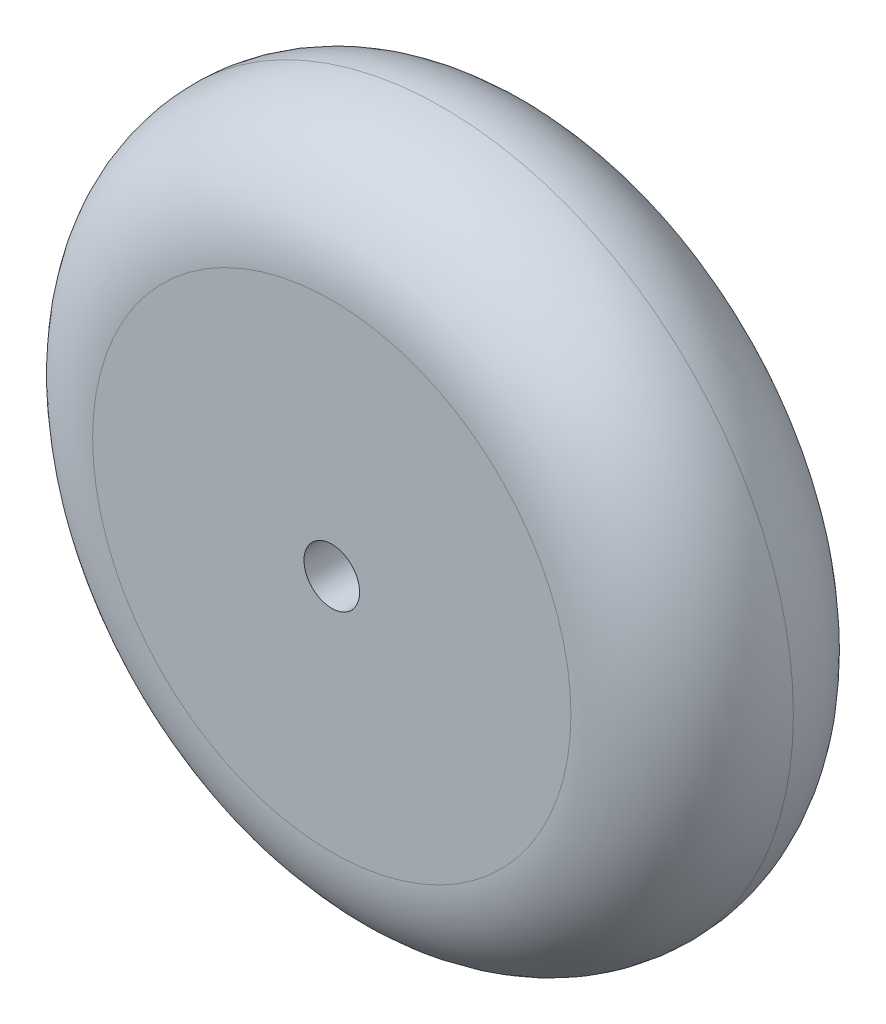
ISO-10303-21;
HEADER;
FILE_DESCRIPTION(('STEP AP214'),'2;1');
FILE_NAME('part.step','',(''),(''),'','','');
FILE_SCHEMA(('AUTOMOTIVE_DESIGN { 1 0 10303 214 1 1 1 1 }'));
ENDSEC;
DATA;
#1=APPLICATION_CONTEXT('core data for automotive mechanical design processes');
#2=APPLICATION_PROTOCOL_DEFINITION('international standard','automotive_design',2000,#1);
#3=PRODUCT_CONTEXT('',#1,'mechanical');
#4=PRODUCT('Part','Part','',(#3));
#5=PRODUCT_RELATED_PRODUCT_CATEGORY('part','',(#4));
#6=PRODUCT_DEFINITION_FORMATION('','',#4);
#7=PRODUCT_DEFINITION_CONTEXT('part definition',#1,'design');
#8=PRODUCT_DEFINITION('design','',#6,#7);
#9=PRODUCT_DEFINITION_SHAPE('','',#8);
#10=(LENGTH_UNIT() NAMED_UNIT(*) SI_UNIT(.MILLI.,.METRE.));
#11=(NAMED_UNIT(*) PLANE_ANGLE_UNIT() SI_UNIT($,.RADIAN.));
#12=(NAMED_UNIT(*) SI_UNIT($,.STERADIAN.) SOLID_ANGLE_UNIT());
#13=UNCERTAINTY_MEASURE_WITH_UNIT(LENGTH_MEASURE(1.E-05),#10,'distance_accuracy_value','');
#14=(GEOMETRIC_REPRESENTATION_CONTEXT(3) GLOBAL_UNCERTAINTY_ASSIGNED_CONTEXT((#13)) GLOBAL_UNIT_ASSIGNED_CONTEXT((#10,
#11,#12)) REPRESENTATION_CONTEXT('',''));
#15=CARTESIAN_POINT('',(0.,0.,0.));
#16=DIRECTION('',(0.,0.,1.));
#17=DIRECTION('',(1.,0.,0.));
#18=AXIS2_PLACEMENT_3D('',#15,#16,#17);
#19=CARTESIAN_POINT('',(0.,0.,25.4));
#20=DIRECTION('',(0.,0.,1.));
#21=DIRECTION('',(1.,0.,0.));
#22=AXIS2_PLACEMENT_3D('',#19,#20,#21);
#23=PLANE('',#22);
#24=CARTESIAN_POINT('',(0.,0.,25.4));
#25=DIRECTION('',(0.,0.,1.));
#26=DIRECTION('',(1.,0.,0.));
#27=AXIS2_PLACEMENT_3D('',#24,#25,#26);
#28=CIRCLE('',#27,27.305);
#29=CARTESIAN_POINT('',(27.305,0.,25.4));
#30=VERTEX_POINT('',#29);
#31=EDGE_CURVE('E10',#30,#30,#28,.T.);
#32=ORIENTED_EDGE('',*,*,#31,.T.);
#33=EDGE_LOOP('',(#32));
#34=FACE_BOUND('',#33,.T.);
#35=CARTESIAN_POINT('',(0.,0.,25.4));
#36=DIRECTION('',(0.,0.,1.));
#37=DIRECTION('',(1.,0.,0.));
#38=AXIS2_PLACEMENT_3D('',#35,#36,#37);
#39=CIRCLE('',#38,3.175);
#40=CARTESIAN_POINT('',(3.175,0.,25.4));
#41=VERTEX_POINT('',#40);
#42=EDGE_CURVE('E51',#41,#41,#39,.T.);
#43=ORIENTED_EDGE('',*,*,#42,.F.);
#44=EDGE_LOOP('',(#43));
#45=FACE_BOUND('',#44,.T.);
#46=ADVANCED_FACE('F34',(#34,#45),#23,.T.);
#47=CARTESIAN_POINT('',(0.,0.,0.));
#48=DIRECTION('',(0.,0.,1.));
#49=DIRECTION('',(1.,0.,0.));
#50=AXIS2_PLACEMENT_3D('',#47,#48,#49);
#51=PLANE('',#50);
#52=CARTESIAN_POINT('',(0.,0.,0.));
#53=DIRECTION('',(0.,0.,1.));
#54=DIRECTION('',(1.,0.,0.));
#55=AXIS2_PLACEMENT_3D('',#52,#53,#54);
#56=CIRCLE('',#55,27.305);
#57=CARTESIAN_POINT('',(27.305,0.,0.));
#58=VERTEX_POINT('',#57);
#59=EDGE_CURVE('E42',#58,#58,#56,.F.);
#60=ORIENTED_EDGE('',*,*,#59,.T.);
#61=EDGE_LOOP('',(#60));
#62=FACE_BOUND('',#61,.T.);
#63=CARTESIAN_POINT('',(0.,0.,0.));
#64=DIRECTION('',(0.,0.,1.));
#65=DIRECTION('',(1.,0.,0.));
#66=AXIS2_PLACEMENT_3D('',#63,#64,#65);
#67=CIRCLE('',#66,3.175);
#68=CARTESIAN_POINT('',(3.175,0.,0.));
#69=VERTEX_POINT('',#68);
#70=EDGE_CURVE('E46',#69,#69,#67,.F.);
#71=ORIENTED_EDGE('',*,*,#70,.F.);
#72=EDGE_LOOP('',(#71));
#73=FACE_BOUND('',#72,.T.);
#74=ADVANCED_FACE('F68',(#62,#73),#51,.F.);
#75=CARTESIAN_POINT('',(0.,0.,-0.001000000000001));
#76=DIRECTION('',(0.,0.,1.));
#77=DIRECTION('',(1.,0.,0.));
#78=AXIS2_PLACEMENT_3D('',#75,#76,#77);
#79=CYLINDRICAL_SURFACE('',#78,3.175);
#80=CARTESIAN_POINT('',(3.175,0.,25.4));
#81=CARTESIAN_POINT('',(3.175,0.,25.1354166666667));
#82=CARTESIAN_POINT('',(3.175,0.,24.8708333333333));
#83=CARTESIAN_POINT('',(3.175,0.,24.3416666666667));
#84=CARTESIAN_POINT('',(3.175,0.,24.0770833333333));
#85=CARTESIAN_POINT('',(3.175,0.,23.5479166666667));
#86=CARTESIAN_POINT('',(3.175,0.,23.2833333333333));
#87=CARTESIAN_POINT('',(3.175,0.,22.7541666666667));
#88=CARTESIAN_POINT('',(3.175,0.,22.4895833333333));
#89=CARTESIAN_POINT('',(3.175,0.,21.9604166666667));
#90=CARTESIAN_POINT('',(3.175,0.,21.6958333333333));
#91=CARTESIAN_POINT('',(3.175,0.,21.1666666666667));
#92=CARTESIAN_POINT('',(3.175,0.,20.9020833333333));
#93=CARTESIAN_POINT('',(3.175,0.,20.3729166666667));
#94=CARTESIAN_POINT('',(3.175,0.,20.1083333333333));
#95=CARTESIAN_POINT('',(3.175,0.,19.5791666666667));
#96=CARTESIAN_POINT('',(3.175,0.,19.3145833333333));
#97=CARTESIAN_POINT('',(3.175,0.,18.7854166666667));
#98=CARTESIAN_POINT('',(3.175,0.,18.5208333333333));
#99=CARTESIAN_POINT('',(3.175,0.,17.9916666666667));
#100=CARTESIAN_POINT('',(3.175,0.,17.7270833333333));
#101=CARTESIAN_POINT('',(3.175,0.,17.1979166666667));
#102=CARTESIAN_POINT('',(3.175,0.,16.9333333333333));
#103=CARTESIAN_POINT('',(3.175,0.,16.4041666666667));
#104=CARTESIAN_POINT('',(3.175,0.,16.1395833333333));
#105=CARTESIAN_POINT('',(3.175,0.,15.6104166666667));
#106=CARTESIAN_POINT('',(3.175,0.,15.3458333333333));
#107=CARTESIAN_POINT('',(3.175,0.,14.8166666666667));
#108=CARTESIAN_POINT('',(3.175,0.,14.5520833333333));
#109=CARTESIAN_POINT('',(3.175,0.,14.0229166666667));
#110=CARTESIAN_POINT('',(3.175,0.,13.7583333333333));
#111=CARTESIAN_POINT('',(3.175,0.,13.2291666666667));
#112=CARTESIAN_POINT('',(3.175,0.,12.9645833333333));
#113=CARTESIAN_POINT('',(3.175,0.,12.4354166666667));
#114=CARTESIAN_POINT('',(3.175,0.,12.1708333333333));
#115=CARTESIAN_POINT('',(3.175,0.,11.6416666666667));
#116=CARTESIAN_POINT('',(3.175,0.,11.3770833333333));
#117=CARTESIAN_POINT('',(3.175,0.,10.8479166666667));
#118=CARTESIAN_POINT('',(3.175,0.,10.5833333333333));
#119=CARTESIAN_POINT('',(3.175,0.,10.0541666666667));
#120=CARTESIAN_POINT('',(3.175,0.,9.78958333333333));
#121=CARTESIAN_POINT('',(3.175,0.,9.26041666666666));
#122=CARTESIAN_POINT('',(3.175,0.,8.99583333333333));
#123=CARTESIAN_POINT('',(3.175,0.,8.46666666666666));
#124=CARTESIAN_POINT('',(3.175,0.,8.20208333333333));
#125=CARTESIAN_POINT('',(3.175,0.,7.67291666666667));
#126=CARTESIAN_POINT('',(3.175,0.,7.40833333333333));
#127=CARTESIAN_POINT('',(3.175,0.,6.87916666666667));
#128=CARTESIAN_POINT('',(3.175,0.,6.61458333333333));
#129=CARTESIAN_POINT('',(3.175,0.,6.08541666666667));
#130=CARTESIAN_POINT('',(3.175,0.,5.82083333333333));
#131=CARTESIAN_POINT('',(3.175,0.,5.29166666666667));
#132=CARTESIAN_POINT('',(3.175,0.,5.02708333333333));
#133=CARTESIAN_POINT('',(3.175,0.,4.49791666666667));
#134=CARTESIAN_POINT('',(3.175,0.,4.23333333333333));
#135=CARTESIAN_POINT('',(3.175,0.,3.70416666666667));
#136=CARTESIAN_POINT('',(3.175,0.,3.43958333333333));
#137=CARTESIAN_POINT('',(3.175,0.,2.91041666666667));
#138=CARTESIAN_POINT('',(3.175,0.,2.64583333333333));
#139=CARTESIAN_POINT('',(3.175,0.,2.11666666666667));
#140=CARTESIAN_POINT('',(3.175,0.,1.85208333333333));
#141=CARTESIAN_POINT('',(3.175,0.,1.32291666666667));
#142=CARTESIAN_POINT('',(3.175,0.,1.05833333333333));
#143=CARTESIAN_POINT('',(3.175,0.,0.529166666666666));
#144=CARTESIAN_POINT('',(3.175,0.,0.264583333333333));
#145=CARTESIAN_POINT('',(3.175,0.,0.));
#146=B_SPLINE_CURVE_WITH_KNOTS('',3,(#80,#81,#82,#83,#84,#85,#86,#87,#88,#89,#90,#91,#92,#93,
#94,#95,#96,#97,#98,#99,#100,#101,#102,#103,#104,#105,#106,#107,#108,#109,#110,#111,#112,#113,
#114,#115,#116,#117,#118,#119,#120,#121,#122,#123,#124,#125,#126,#127,#128,#129,#130,#131,#132,
#133,#134,#135,#136,#137,#138,#139,#140,#141,#142,#143,#144,#145),.UNSPECIFIED.,.F.,.F.,(4,2,2,
2,2,2,2,2,2,2,2,2,2,2,2,2,2,2,2,2,2,2,2,2,2,2,2,2,2,2,2,2,4),(0.,0.793749999999999,1.5875,
2.38125,3.175,3.96875,4.7625,5.55625,6.35,7.14375,7.9375,8.73125,9.525,10.31875,11.1125,
11.90625,12.7,13.49375,14.2875,15.08125,15.875,16.66875,17.4625,18.25625,19.05,19.84375,20.6375,
21.43125,22.225,23.01875,23.8125,24.60625,25.4),.UNSPECIFIED.);
#147=EDGE_CURVE('BSEAM61',#41,#69,#146,.T.);
#148=ORIENTED_EDGE('',*,*,#42,.T.);
#149=ORIENTED_EDGE('',*,*,#70,.T.);
#150=ORIENTED_EDGE('',*,*,#147,.T.);
#151=ORIENTED_EDGE('',*,*,#147,.F.);
#152=EDGE_LOOP('',(#148,#150,#149,#151));
#153=FACE_BOUND('',#152,.T.);
#154=ADVANCED_FACE('F61',(#153),#79,.F.);
#155=CARTESIAN_POINT('',(0.,0.,12.7));
#156=DIRECTION('',(0.,0.,1.));
#157=DIRECTION('',(1.,0.,0.));
#158=AXIS2_PLACEMENT_3D('',#155,#156,#157);
#159=TOROIDAL_SURFACE('',#158,27.305,12.7);
#160=ORIENTED_EDGE('',*,*,#31,.F.);
#161=EDGE_LOOP('',(#160));
#162=FACE_BOUND('',#161,.T.);
#163=CARTESIAN_POINT('',(0.,0.,12.7));
#164=DIRECTION('',(0.,0.,1.));
#165=DIRECTION('',(1.,0.,0.));
#166=AXIS2_PLACEMENT_3D('',#163,#164,#165);
#167=CIRCLE('',#166,40.005);
#168=CARTESIAN_POINT('',(40.005,0.,12.7));
#169=VERTEX_POINT('',#168);
#170=EDGE_CURVE('E38',#169,#169,#167,.F.);
#171=ORIENTED_EDGE('',*,*,#170,.F.);
#172=EDGE_LOOP('',(#171));
#173=FACE_BOUND('',#172,.T.);
#174=ADVANCED_FACE('F36',(#162,#173),#159,.T.);
#175=CARTESIAN_POINT('',(0.,0.,12.7));
#176=DIRECTION('',(0.,0.,1.));
#177=DIRECTION('',(1.,0.,0.));
#178=AXIS2_PLACEMENT_3D('',#175,#176,#177);
#179=TOROIDAL_SURFACE('',#178,27.305,12.7);
#180=ORIENTED_EDGE('',*,*,#59,.F.);
#181=EDGE_LOOP('',(#180));
#182=FACE_BOUND('',#181,.T.);
#183=ORIENTED_EDGE('',*,*,#170,.T.);
#184=EDGE_LOOP('',(#183));
#185=FACE_BOUND('',#184,.T.);
#186=ADVANCED_FACE('F58',(#182,#185),#179,.T.);
#187=CLOSED_SHELL('',(#46,#74,#154,#174,#186));
#188=MANIFOLD_SOLID_BREP('B2',#187);
#189=ADVANCED_BREP_SHAPE_REPRESENTATION('',(#18,#188),#14);
#190=SHAPE_DEFINITION_REPRESENTATION(#9,#189);
ENDSEC;
END-ISO-10303-21;
